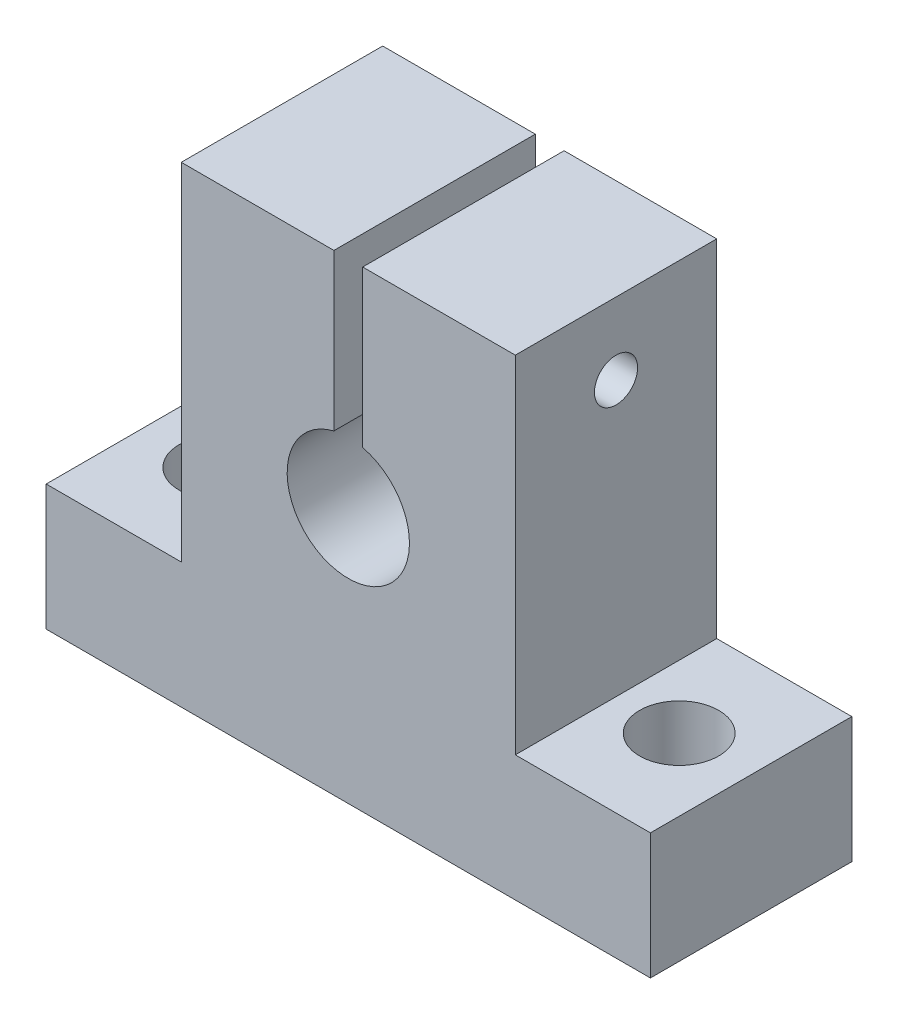
ISO-10303-21;
HEADER;
FILE_DESCRIPTION(('STEP AP214'),'2;1');
FILE_NAME('part.step','',(''),(''),'','','');
FILE_SCHEMA(('AUTOMOTIVE_DESIGN { 1 0 10303 214 1 1 1 1 }'));
ENDSEC;
DATA;
#1=APPLICATION_CONTEXT('core data for automotive mechanical design processes');
#2=APPLICATION_PROTOCOL_DEFINITION('international standard','automotive_design',2000,#1);
#3=PRODUCT_CONTEXT('',#1,'mechanical');
#4=PRODUCT('Part','Part','',(#3));
#5=PRODUCT_RELATED_PRODUCT_CATEGORY('part','',(#4));
#6=PRODUCT_DEFINITION_FORMATION('','',#4);
#7=PRODUCT_DEFINITION_CONTEXT('part definition',#1,'design');
#8=PRODUCT_DEFINITION('design','',#6,#7);
#9=PRODUCT_DEFINITION_SHAPE('','',#8);
#10=(LENGTH_UNIT() NAMED_UNIT(*) SI_UNIT(.MILLI.,.METRE.));
#11=(NAMED_UNIT(*) PLANE_ANGLE_UNIT() SI_UNIT($,.RADIAN.));
#12=(NAMED_UNIT(*) SI_UNIT($,.STERADIAN.) SOLID_ANGLE_UNIT());
#13=UNCERTAINTY_MEASURE_WITH_UNIT(LENGTH_MEASURE(1.E-05),#10,'distance_accuracy_value','');
#14=(GEOMETRIC_REPRESENTATION_CONTEXT(3) GLOBAL_UNCERTAINTY_ASSIGNED_CONTEXT((#13)) GLOBAL_UNIT_ASSIGNED_CONTEXT((#10,
#11,#12)) REPRESENTATION_CONTEXT('',''));
#15=CARTESIAN_POINT('',(0.,0.,0.));
#16=DIRECTION('',(0.,0.,1.));
#17=DIRECTION('',(1.,0.,0.));
#18=AXIS2_PLACEMENT_3D('',#15,#16,#17);
#19=CARTESIAN_POINT('',(0.,8.73752791003439,14.));
#20=DIRECTION('',(1.,0.,0.));
#21=DIRECTION('',(0.,0.,-1.));
#22=AXIS2_PLACEMENT_3D('',#19,#20,#21);
#23=PLANE('',#22);
#24=DIRECTION('',(0.,-1.,0.));
#25=VECTOR('',#24,1.);
#26=CARTESIAN_POINT('',(0.,8.73752791003439,0.));
#27=LINE('',#26,#25);
#28=CARTESIAN_POINT('',(0.,8.73752791003439,0.));
#29=VERTEX_POINT('',#28);
#30=CARTESIAN_POINT('',(0.,0.,0.));
#31=VERTEX_POINT('',#30);
#32=EDGE_CURVE('E152',#29,#31,#27,.T.);
#33=ORIENTED_EDGE('',*,*,#32,.T.);
#34=DIRECTION('',(0.,0.,-1.));
#35=VECTOR('',#34,1.);
#36=CARTESIAN_POINT('',(0.,0.,14.));
#37=LINE('',#36,#35);
#38=CARTESIAN_POINT('',(0.,0.,14.));
#39=VERTEX_POINT('',#38);
#40=EDGE_CURVE('E39',#39,#31,#37,.T.);
#41=ORIENTED_EDGE('',*,*,#40,.F.);
#42=DIRECTION('',(0.,-1.,0.));
#43=VECTOR('',#42,1.);
#44=CARTESIAN_POINT('',(0.,8.73752791003439,14.));
#45=LINE('',#44,#43);
#46=CARTESIAN_POINT('',(0.,8.73752791003439,14.));
#47=VERTEX_POINT('',#46);
#48=EDGE_CURVE('E174',#47,#39,#45,.T.);
#49=ORIENTED_EDGE('',*,*,#48,.F.);
#50=DIRECTION('',(0.,0.,-1.));
#51=VECTOR('',#50,1.);
#52=CARTESIAN_POINT('',(0.,8.73752791003439,14.));
#53=LINE('',#52,#51);
#54=EDGE_CURVE('E148',#47,#29,#53,.T.);
#55=ORIENTED_EDGE('',*,*,#54,.T.);
#56=EDGE_LOOP('',(#33,#41,#49,#55));
#57=FACE_BOUND('',#56,.T.);
#58=ADVANCED_FACE('F31',(#57),#23,.F.);
#59=CARTESIAN_POINT('',(0.,0.,14.));
#60=DIRECTION('',(0.,1.,0.));
#61=DIRECTION('',(0.,0.,1.));
#62=AXIS2_PLACEMENT_3D('',#59,#60,#61);
#63=PLANE('',#62);
#64=CARTESIAN_POINT('',(37.,0.,7.));
#65=DIRECTION('',(0.,1.,0.));
#66=DIRECTION('',(-1.,0.,0.));
#67=AXIS2_PLACEMENT_3D('',#64,#65,#66);
#68=CIRCLE('',#67,2.75);
#69=CARTESIAN_POINT('',(34.25,0.,7.));
#70=VERTEX_POINT('',#69);
#71=EDGE_CURVE('E245',#70,#70,#68,.T.);
#72=ORIENTED_EDGE('',*,*,#71,.T.);
#73=EDGE_LOOP('',(#72));
#74=FACE_BOUND('',#73,.T.);
#75=CARTESIAN_POINT('',(5.,0.,7.));
#76=DIRECTION('',(0.,1.,0.));
#77=DIRECTION('',(-1.,0.,0.));
#78=AXIS2_PLACEMENT_3D('',#75,#76,#77);
#79=CIRCLE('',#78,2.75);
#80=CARTESIAN_POINT('',(2.25,0.,7.));
#81=VERTEX_POINT('',#80);
#82=EDGE_CURVE('E241',#81,#81,#79,.T.);
#83=ORIENTED_EDGE('',*,*,#82,.T.);
#84=EDGE_LOOP('',(#83));
#85=FACE_BOUND('',#84,.T.);
#86=DIRECTION('',(1.,0.,0.));
#87=VECTOR('',#86,1.);
#88=CARTESIAN_POINT('',(0.,0.,0.));
#89=LINE('',#88,#87);
#90=CARTESIAN_POINT('',(42.,0.,0.));
#91=VERTEX_POINT('',#90);
#92=EDGE_CURVE('E155',#31,#91,#89,.T.);
#93=ORIENTED_EDGE('',*,*,#92,.T.);
#94=DIRECTION('',(0.,0.,-1.));
#95=VECTOR('',#94,1.);
#96=CARTESIAN_POINT('',(42.,0.,14.));
#97=LINE('',#96,#95);
#98=CARTESIAN_POINT('',(42.,0.,14.));
#99=VERTEX_POINT('',#98);
#100=EDGE_CURVE('E190',#99,#91,#97,.T.);
#101=ORIENTED_EDGE('',*,*,#100,.F.);
#102=DIRECTION('',(1.,0.,0.));
#103=VECTOR('',#102,1.);
#104=CARTESIAN_POINT('',(0.,0.,14.));
#105=LINE('',#104,#103);
#106=EDGE_CURVE('E102',#39,#99,#105,.T.);
#107=ORIENTED_EDGE('',*,*,#106,.F.);
#108=ORIENTED_EDGE('',*,*,#40,.T.);
#109=EDGE_LOOP('',(#93,#101,#107,#108));
#110=FACE_BOUND('',#109,.T.);
#111=ADVANCED_FACE('F194',(#74,#85,#110),#63,.F.);
#112=CARTESIAN_POINT('',(42.,0.,14.));
#113=DIRECTION('',(-1.,0.,0.));
#114=DIRECTION('',(0.,0.,1.));
#115=AXIS2_PLACEMENT_3D('',#112,#113,#114);
#116=PLANE('',#115);
#117=DIRECTION('',(0.,1.,0.));
#118=VECTOR('',#117,1.);
#119=CARTESIAN_POINT('',(42.,0.,0.));
#120=LINE('',#119,#118);
#121=CARTESIAN_POINT('',(42.,8.73752791003439,0.));
#122=VERTEX_POINT('',#121);
#123=EDGE_CURVE('E157',#91,#122,#120,.T.);
#124=ORIENTED_EDGE('',*,*,#123,.T.);
#125=DIRECTION('',(0.,0.,-1.));
#126=VECTOR('',#125,1.);
#127=CARTESIAN_POINT('',(42.,8.73752791003439,14.));
#128=LINE('',#127,#126);
#129=CARTESIAN_POINT('',(42.,8.73752791003439,14.));
#130=VERTEX_POINT('',#129);
#131=EDGE_CURVE('E187',#130,#122,#128,.T.);
#132=ORIENTED_EDGE('',*,*,#131,.F.);
#133=DIRECTION('',(0.,1.,0.));
#134=VECTOR('',#133,1.);
#135=CARTESIAN_POINT('',(42.,0.,14.));
#136=LINE('',#135,#134);
#137=EDGE_CURVE('E215',#99,#130,#136,.T.);
#138=ORIENTED_EDGE('',*,*,#137,.F.);
#139=ORIENTED_EDGE('',*,*,#100,.T.);
#140=EDGE_LOOP('',(#124,#132,#138,#139));
#141=FACE_BOUND('',#140,.T.);
#142=ADVANCED_FACE('F206',(#141),#116,.F.);
#143=CARTESIAN_POINT('',(42.,8.73752791003439,14.));
#144=DIRECTION('',(0.,-1.,0.));
#145=DIRECTION('',(1.,0.,0.));
#146=AXIS2_PLACEMENT_3D('',#143,#144,#145);
#147=PLANE('',#146);
#148=CARTESIAN_POINT('',(37.,8.7375279100344,7.));
#149=DIRECTION('',(0.,1.,0.));
#150=DIRECTION('',(-1.,0.,0.));
#151=AXIS2_PLACEMENT_3D('',#148,#149,#150);
#152=CIRCLE('',#151,2.75);
#153=CARTESIAN_POINT('',(34.25,8.7375279100344,7.));
#154=VERTEX_POINT('',#153);
#155=EDGE_CURVE('E248',#154,#154,#152,.T.);
#156=ORIENTED_EDGE('',*,*,#155,.F.);
#157=EDGE_LOOP('',(#156));
#158=FACE_BOUND('',#157,.T.);
#159=DIRECTION('',(-1.,0.,0.));
#160=VECTOR('',#159,1.);
#161=CARTESIAN_POINT('',(42.,8.73752791003439,0.));
#162=LINE('',#161,#160);
#163=CARTESIAN_POINT('',(32.609283578352,8.73752791003439,0.));
#164=VERTEX_POINT('',#163);
#165=EDGE_CURVE('E159',#122,#164,#162,.T.);
#166=ORIENTED_EDGE('',*,*,#165,.T.);
#167=DIRECTION('',(0.,0.,-1.));
#168=VECTOR('',#167,1.);
#169=CARTESIAN_POINT('',(32.609283578352,8.73752791003439,14.));
#170=LINE('',#169,#168);
#171=CARTESIAN_POINT('',(32.609283578352,8.73752791003439,14.));
#172=VERTEX_POINT('',#171);
#173=EDGE_CURVE('E184',#172,#164,#170,.T.);
#174=ORIENTED_EDGE('',*,*,#173,.F.);
#175=DIRECTION('',(-1.,0.,0.));
#176=VECTOR('',#175,1.);
#177=CARTESIAN_POINT('',(42.,8.73752791003439,14.));
#178=LINE('',#177,#176);
#179=EDGE_CURVE('E212',#130,#172,#178,.T.);
#180=ORIENTED_EDGE('',*,*,#179,.F.);
#181=ORIENTED_EDGE('',*,*,#131,.T.);
#182=EDGE_LOOP('',(#166,#174,#180,#181));
#183=FACE_BOUND('',#182,.T.);
#184=ADVANCED_FACE('F210',(#158,#183),#147,.F.);
#185=CARTESIAN_POINT('',(32.609283578352,8.73752791003439,14.));
#186=DIRECTION('',(-1.,0.,0.));
#187=DIRECTION('',(0.,0.,1.));
#188=AXIS2_PLACEMENT_3D('',#185,#186,#187);
#189=PLANE('',#188);
#190=CARTESIAN_POINT('',(32.609283578352,27.8,7.));
#191=DIRECTION('',(1.,0.,0.));
#192=DIRECTION('',(0.,0.,-1.));
#193=AXIS2_PLACEMENT_3D('',#190,#191,#192);
#194=CIRCLE('',#193,1.5);
#195=CARTESIAN_POINT('',(32.609283578352,27.8,5.5));
#196=VERTEX_POINT('',#195);
#197=EDGE_CURVE('E259',#196,#196,#194,.T.);
#198=ORIENTED_EDGE('',*,*,#197,.F.);
#199=EDGE_LOOP('',(#198));
#200=FACE_BOUND('',#199,.T.);
#201=DIRECTION('',(0.,1.,0.));
#202=VECTOR('',#201,1.);
#203=CARTESIAN_POINT('',(32.609283578352,8.73752791003439,0.));
#204=LINE('',#203,#202);
#205=CARTESIAN_POINT('',(32.609283578352,32.8,0.));
#206=VERTEX_POINT('',#205);
#207=EDGE_CURVE('E161',#164,#206,#204,.T.);
#208=ORIENTED_EDGE('',*,*,#207,.T.);
#209=DIRECTION('',(0.,0.,-1.));
#210=VECTOR('',#209,1.);
#211=CARTESIAN_POINT('',(32.609283578352,32.8,14.));
#212=LINE('',#211,#210);
#213=CARTESIAN_POINT('',(32.609283578352,32.8,14.));
#214=VERTEX_POINT('',#213);
#215=EDGE_CURVE('E181',#214,#206,#212,.T.);
#216=ORIENTED_EDGE('',*,*,#215,.F.);
#217=DIRECTION('',(0.,1.,0.));
#218=VECTOR('',#217,1.);
#219=CARTESIAN_POINT('',(32.609283578352,8.73752791003439,14.));
#220=LINE('',#219,#218);
#221=EDGE_CURVE('E214',#172,#214,#220,.T.);
#222=ORIENTED_EDGE('',*,*,#221,.F.);
#223=ORIENTED_EDGE('',*,*,#173,.T.);
#224=EDGE_LOOP('',(#208,#216,#222,#223));
#225=FACE_BOUND('',#224,.T.);
#226=ADVANCED_FACE('F308',(#200,#225),#189,.F.);
#227=CARTESIAN_POINT('',(22.,32.8,14.));
#228=DIRECTION('',(0.,-1.,0.));
#229=DIRECTION('',(0.,0.,-1.));
#230=AXIS2_PLACEMENT_3D('',#227,#228,#229);
#231=PLANE('',#230);
#232=DIRECTION('',(-1.,0.,0.));
#233=VECTOR('',#232,1.);
#234=CARTESIAN_POINT('',(22.,32.8,0.));
#235=LINE('',#234,#233);
#236=CARTESIAN_POINT('',(22.,32.8,0.));
#237=VERTEX_POINT('',#236);
#238=EDGE_CURVE('E163',#206,#237,#235,.T.);
#239=ORIENTED_EDGE('',*,*,#238,.T.);
#240=DIRECTION('',(0.,0.,-1.));
#241=VECTOR('',#240,1.);
#242=CARTESIAN_POINT('',(22.,32.8,14.));
#243=LINE('',#242,#241);
#244=CARTESIAN_POINT('',(22.,32.8,14.));
#245=VERTEX_POINT('',#244);
#246=EDGE_CURVE('E178',#245,#237,#243,.T.);
#247=ORIENTED_EDGE('',*,*,#246,.F.);
#248=DIRECTION('',(-1.,0.,0.));
#249=VECTOR('',#248,1.);
#250=CARTESIAN_POINT('',(22.,32.8,14.));
#251=LINE('',#250,#249);
#252=EDGE_CURVE('E217',#214,#245,#251,.T.);
#253=ORIENTED_EDGE('',*,*,#252,.F.);
#254=ORIENTED_EDGE('',*,*,#215,.T.);
#255=EDGE_LOOP('',(#239,#247,#253,#254));
#256=FACE_BOUND('',#255,.T.);
#257=ADVANCED_FACE('F312',(#256),#231,.F.);
#258=CARTESIAN_POINT('',(22.,17.8,14.));
#259=DIRECTION('',(1.,0.,0.));
#260=DIRECTION('',(0.,0.,-1.));
#261=AXIS2_PLACEMENT_3D('',#258,#259,#260);
#262=PLANE('',#261);
#263=CARTESIAN_POINT('',(22.,27.8,7.));
#264=DIRECTION('',(1.,0.,0.));
#265=DIRECTION('',(0.,0.,-1.));
#266=AXIS2_PLACEMENT_3D('',#263,#264,#265);
#267=CIRCLE('',#266,1.5);
#268=CARTESIAN_POINT('',(22.,27.8,5.5));
#269=VERTEX_POINT('',#268);
#270=EDGE_CURVE('E251',#269,#269,#267,.T.);
#271=ORIENTED_EDGE('',*,*,#270,.T.);
#272=EDGE_LOOP('',(#271));
#273=FACE_BOUND('',#272,.T.);
#274=DIRECTION('',(0.,-1.,0.));
#275=VECTOR('',#274,1.);
#276=CARTESIAN_POINT('',(22.,17.8,0.));
#277=LINE('',#276,#275);
#278=CARTESIAN_POINT('',(22.,21.9306779104646,0.));
#279=VERTEX_POINT('',#278);
#280=EDGE_CURVE('E165',#237,#279,#277,.T.);
#281=ORIENTED_EDGE('',*,*,#280,.T.);
#282=DIRECTION('',(0.,0.,1.));
#283=VECTOR('',#282,1.);
#284=CARTESIAN_POINT('',(22.,21.9306779104646,0.));
#285=LINE('',#284,#283);
#286=CARTESIAN_POINT('',(22.,21.9306779104646,14.));
#287=VERTEX_POINT('',#286);
#288=EDGE_CURVE('E46',#279,#287,#285,.T.);
#289=ORIENTED_EDGE('',*,*,#288,.T.);
#290=DIRECTION('',(0.,-1.,0.));
#291=VECTOR('',#290,1.);
#292=CARTESIAN_POINT('',(22.,17.8,14.));
#293=LINE('',#292,#291);
#294=EDGE_CURVE('E223',#245,#287,#293,.T.);
#295=ORIENTED_EDGE('',*,*,#294,.F.);
#296=ORIENTED_EDGE('',*,*,#246,.T.);
#297=EDGE_LOOP('',(#281,#289,#295,#296));
#298=FACE_BOUND('',#297,.T.);
#299=ADVANCED_FACE('F232',(#273,#298),#262,.F.);
#300=CARTESIAN_POINT('',(20.,32.8,14.));
#301=DIRECTION('',(-1.,0.,0.));
#302=DIRECTION('',(0.,0.,1.));
#303=AXIS2_PLACEMENT_3D('',#300,#301,#302);
#304=PLANE('',#303);
#305=CARTESIAN_POINT('',(20.,27.8,7.));
#306=DIRECTION('',(-1.,0.,0.));
#307=DIRECTION('',(0.,0.,1.));
#308=AXIS2_PLACEMENT_3D('',#305,#306,#307);
#309=CIRCLE('',#308,1.5);
#310=CARTESIAN_POINT('',(20.,27.8,8.5));
#311=VERTEX_POINT('',#310);
#312=EDGE_CURVE('E256',#311,#311,#309,.T.);
#313=ORIENTED_EDGE('',*,*,#312,.T.);
#314=EDGE_LOOP('',(#313));
#315=FACE_BOUND('',#314,.T.);
#316=DIRECTION('',(0.,1.,0.));
#317=VECTOR('',#316,1.);
#318=CARTESIAN_POINT('',(20.,32.8,14.));
#319=LINE('',#318,#317);
#320=CARTESIAN_POINT('',(20.,21.9306779104646,14.));
#321=VERTEX_POINT('',#320);
#322=CARTESIAN_POINT('',(20.,32.8,14.));
#323=VERTEX_POINT('',#322);
#324=EDGE_CURVE('E131',#321,#323,#319,.T.);
#325=ORIENTED_EDGE('',*,*,#324,.F.);
#326=DIRECTION('',(0.,0.,1.));
#327=VECTOR('',#326,1.);
#328=CARTESIAN_POINT('',(20.,21.9306779104646,0.));
#329=LINE('',#328,#327);
#330=CARTESIAN_POINT('',(20.,21.9306779104646,0.));
#331=VERTEX_POINT('',#330);
#332=EDGE_CURVE('E234',#321,#331,#329,.F.);
#333=ORIENTED_EDGE('',*,*,#332,.T.);
#334=DIRECTION('',(0.,1.,0.));
#335=VECTOR('',#334,1.);
#336=CARTESIAN_POINT('',(20.,32.8,0.));
#337=LINE('',#336,#335);
#338=CARTESIAN_POINT('',(20.,32.8,0.));
#339=VERTEX_POINT('',#338);
#340=EDGE_CURVE('E168',#331,#339,#337,.T.);
#341=ORIENTED_EDGE('',*,*,#340,.T.);
#342=DIRECTION('',(0.,0.,-1.));
#343=VECTOR('',#342,1.);
#344=CARTESIAN_POINT('',(20.,32.8,14.));
#345=LINE('',#344,#343);
#346=EDGE_CURVE('E143',#323,#339,#345,.T.);
#347=ORIENTED_EDGE('',*,*,#346,.F.);
#348=EDGE_LOOP('',(#325,#333,#341,#347));
#349=FACE_BOUND('',#348,.T.);
#350=ADVANCED_FACE('F275',(#315,#349),#304,.F.);
#351=CARTESIAN_POINT('',(9.39071642164796,32.8,14.));
#352=DIRECTION('',(0.,-1.,0.));
#353=DIRECTION('',(0.,0.,-1.));
#354=AXIS2_PLACEMENT_3D('',#351,#352,#353);
#355=PLANE('',#354);
#356=DIRECTION('',(-1.,0.,0.));
#357=VECTOR('',#356,1.);
#358=CARTESIAN_POINT('',(9.39071642164796,32.8,0.));
#359=LINE('',#358,#357);
#360=CARTESIAN_POINT('',(9.39071642164796,32.8,0.));
#361=VERTEX_POINT('',#360);
#362=EDGE_CURVE('E140',#339,#361,#359,.T.);
#363=ORIENTED_EDGE('',*,*,#362,.T.);
#364=DIRECTION('',(0.,0.,-1.));
#365=VECTOR('',#364,1.);
#366=CARTESIAN_POINT('',(9.39071642164796,32.8,14.));
#367=LINE('',#366,#365);
#368=CARTESIAN_POINT('',(9.39071642164796,32.8,14.));
#369=VERTEX_POINT('',#368);
#370=EDGE_CURVE('E137',#369,#361,#367,.T.);
#371=ORIENTED_EDGE('',*,*,#370,.F.);
#372=DIRECTION('',(-1.,0.,0.));
#373=VECTOR('',#372,1.);
#374=CARTESIAN_POINT('',(9.39071642164796,32.8,14.));
#375=LINE('',#374,#373);
#376=EDGE_CURVE('E123',#323,#369,#375,.T.);
#377=ORIENTED_EDGE('',*,*,#376,.F.);
#378=ORIENTED_EDGE('',*,*,#346,.T.);
#379=EDGE_LOOP('',(#363,#371,#377,#378));
#380=FACE_BOUND('',#379,.T.);
#381=ADVANCED_FACE('F138',(#380),#355,.F.);
#382=CARTESIAN_POINT('',(9.39071642164796,32.8,14.));
#383=DIRECTION('',(1.,0.,0.));
#384=DIRECTION('',(0.,0.,-1.));
#385=AXIS2_PLACEMENT_3D('',#382,#383,#384);
#386=PLANE('',#385);
#387=CARTESIAN_POINT('',(9.39071642164796,27.8,7.));
#388=DIRECTION('',(1.,0.,0.));
#389=DIRECTION('',(0.,0.,-1.));
#390=AXIS2_PLACEMENT_3D('',#387,#388,#389);
#391=CIRCLE('',#390,1.5);
#392=CARTESIAN_POINT('',(9.39071642164796,27.8,5.5));
#393=VERTEX_POINT('',#392);
#394=EDGE_CURVE('E34',#393,#393,#391,.T.);
#395=ORIENTED_EDGE('',*,*,#394,.T.);
#396=EDGE_LOOP('',(#395));
#397=FACE_BOUND('',#396,.T.);
#398=DIRECTION('',(0.,-1.,0.));
#399=VECTOR('',#398,1.);
#400=CARTESIAN_POINT('',(9.39071642164796,32.8,0.));
#401=LINE('',#400,#399);
#402=CARTESIAN_POINT('',(9.39071642164796,8.73752791003439,0.));
#403=VERTEX_POINT('',#402);
#404=EDGE_CURVE('E171',#361,#403,#401,.T.);
#405=ORIENTED_EDGE('',*,*,#404,.T.);
#406=DIRECTION('',(0.,0.,-1.));
#407=VECTOR('',#406,1.);
#408=CARTESIAN_POINT('',(9.39071642164796,8.73752791003439,14.));
#409=LINE('',#408,#407);
#410=CARTESIAN_POINT('',(9.39071642164796,8.73752791003439,14.));
#411=VERTEX_POINT('',#410);
#412=EDGE_CURVE('E144',#411,#403,#409,.T.);
#413=ORIENTED_EDGE('',*,*,#412,.F.);
#414=DIRECTION('',(0.,-1.,0.));
#415=VECTOR('',#414,1.);
#416=CARTESIAN_POINT('',(9.39071642164796,32.8,14.));
#417=LINE('',#416,#415);
#418=EDGE_CURVE('E128',#369,#411,#417,.T.);
#419=ORIENTED_EDGE('',*,*,#418,.F.);
#420=ORIENTED_EDGE('',*,*,#370,.T.);
#421=EDGE_LOOP('',(#405,#413,#419,#420));
#422=FACE_BOUND('',#421,.T.);
#423=ADVANCED_FACE('F146',(#397,#422),#386,.F.);
#424=CARTESIAN_POINT('',(9.39071642164796,8.73752791003439,14.));
#425=DIRECTION('',(0.,-1.,0.));
#426=DIRECTION('',(1.,0.,0.));
#427=AXIS2_PLACEMENT_3D('',#424,#425,#426);
#428=PLANE('',#427);
#429=CARTESIAN_POINT('',(5.,8.73752791003439,7.));
#430=DIRECTION('',(0.,1.,0.));
#431=DIRECTION('',(-1.,0.,0.));
#432=AXIS2_PLACEMENT_3D('',#429,#430,#431);
#433=CIRCLE('',#432,2.75);
#434=CARTESIAN_POINT('',(2.25,8.73752791003439,7.));
#435=VERTEX_POINT('',#434);
#436=EDGE_CURVE('E242',#435,#435,#433,.T.);
#437=ORIENTED_EDGE('',*,*,#436,.F.);
#438=EDGE_LOOP('',(#437));
#439=FACE_BOUND('',#438,.T.);
#440=DIRECTION('',(-1.,0.,0.));
#441=VECTOR('',#440,1.);
#442=CARTESIAN_POINT('',(9.39071642164796,8.73752791003439,0.));
#443=LINE('',#442,#441);
#444=EDGE_CURVE('E93',#403,#29,#443,.T.);
#445=ORIENTED_EDGE('',*,*,#444,.T.);
#446=ORIENTED_EDGE('',*,*,#54,.F.);
#447=DIRECTION('',(-1.,0.,0.));
#448=VECTOR('',#447,1.);
#449=CARTESIAN_POINT('',(9.39071642164796,8.73752791003439,14.));
#450=LINE('',#449,#448);
#451=EDGE_CURVE('E54',#411,#47,#450,.T.);
#452=ORIENTED_EDGE('',*,*,#451,.F.);
#453=ORIENTED_EDGE('',*,*,#412,.T.);
#454=EDGE_LOOP('',(#445,#446,#452,#453));
#455=FACE_BOUND('',#454,.T.);
#456=ADVANCED_FACE('F283',(#439,#455),#428,.F.);
#457=CARTESIAN_POINT('',(0.,0.,14.));
#458=DIRECTION('',(0.,0.,1.));
#459=DIRECTION('',(1.,0.,0.));
#460=AXIS2_PLACEMENT_3D('',#457,#458,#459);
#461=PLANE('',#460);
#462=CARTESIAN_POINT('',(21.,17.8,14.));
#463=DIRECTION('',(0.,0.,1.));
#464=DIRECTION('',(1.,0.,0.));
#465=AXIS2_PLACEMENT_3D('',#462,#463,#464);
#466=CIRCLE('',#465,4.25);
#467=EDGE_CURVE('E227',#321,#287,#466,.T.);
#468=ORIENTED_EDGE('',*,*,#467,.F.);
#469=ORIENTED_EDGE('',*,*,#324,.T.);
#470=ORIENTED_EDGE('',*,*,#376,.T.);
#471=ORIENTED_EDGE('',*,*,#418,.T.);
#472=ORIENTED_EDGE('',*,*,#451,.T.);
#473=ORIENTED_EDGE('',*,*,#48,.T.);
#474=ORIENTED_EDGE('',*,*,#106,.T.);
#475=ORIENTED_EDGE('',*,*,#137,.T.);
#476=ORIENTED_EDGE('',*,*,#179,.T.);
#477=ORIENTED_EDGE('',*,*,#221,.T.);
#478=ORIENTED_EDGE('',*,*,#252,.T.);
#479=ORIENTED_EDGE('',*,*,#294,.T.);
#480=EDGE_LOOP('',(#468,#469,#470,#471,#472,#473,#474,#475,#476,#477,#478,#479));
#481=FACE_BOUND('',#480,.T.);
#482=ADVANCED_FACE('F126',(#481),#461,.T.);
#483=CARTESIAN_POINT('',(0.,0.,0.));
#484=DIRECTION('',(0.,0.,1.));
#485=DIRECTION('',(1.,0.,0.));
#486=AXIS2_PLACEMENT_3D('',#483,#484,#485);
#487=PLANE('',#486);
#488=ORIENTED_EDGE('',*,*,#340,.F.);
#489=CARTESIAN_POINT('',(21.,17.8,0.));
#490=DIRECTION('',(0.,0.,1.));
#491=DIRECTION('',(1.,0.,0.));
#492=AXIS2_PLACEMENT_3D('',#489,#490,#491);
#493=CIRCLE('',#492,4.25);
#494=EDGE_CURVE('E11',#331,#279,#493,.T.);
#495=ORIENTED_EDGE('',*,*,#494,.T.);
#496=ORIENTED_EDGE('',*,*,#280,.F.);
#497=ORIENTED_EDGE('',*,*,#238,.F.);
#498=ORIENTED_EDGE('',*,*,#207,.F.);
#499=ORIENTED_EDGE('',*,*,#165,.F.);
#500=ORIENTED_EDGE('',*,*,#123,.F.);
#501=ORIENTED_EDGE('',*,*,#92,.F.);
#502=ORIENTED_EDGE('',*,*,#32,.F.);
#503=ORIENTED_EDGE('',*,*,#444,.F.);
#504=ORIENTED_EDGE('',*,*,#404,.F.);
#505=ORIENTED_EDGE('',*,*,#362,.F.);
#506=EDGE_LOOP('',(#488,#495,#496,#497,#498,#499,#500,#501,#502,#503,#504,#505));
#507=FACE_BOUND('',#506,.T.);
#508=ADVANCED_FACE('F200',(#507),#487,.F.);
#509=CARTESIAN_POINT('',(21.,17.8,0.));
#510=DIRECTION('',(0.,0.,1.));
#511=DIRECTION('',(1.,0.,0.));
#512=AXIS2_PLACEMENT_3D('',#509,#510,#511);
#513=CYLINDRICAL_SURFACE('',#512,4.25);
#514=ORIENTED_EDGE('',*,*,#494,.F.);
#515=ORIENTED_EDGE('',*,*,#332,.F.);
#516=ORIENTED_EDGE('',*,*,#467,.T.);
#517=ORIENTED_EDGE('',*,*,#288,.F.);
#518=EDGE_LOOP('',(#514,#515,#516,#517));
#519=FACE_BOUND('',#518,.T.);
#520=ADVANCED_FACE('F280',(#519),#513,.F.);
#521=CARTESIAN_POINT('',(5.,0.,7.));
#522=DIRECTION('',(0.,1.,0.));
#523=DIRECTION('',(-1.,0.,0.));
#524=AXIS2_PLACEMENT_3D('',#521,#522,#523);
#525=CYLINDRICAL_SURFACE('',#524,2.75);
#526=ORIENTED_EDGE('',*,*,#82,.F.);
#527=EDGE_LOOP('',(#526));
#528=FACE_BOUND('',#527,.T.);
#529=ORIENTED_EDGE('',*,*,#436,.T.);
#530=EDGE_LOOP('',(#529));
#531=FACE_BOUND('',#530,.T.);
#532=ADVANCED_FACE('F357',(#528,#531),#525,.F.);
#533=CARTESIAN_POINT('',(37.,0.,7.));
#534=DIRECTION('',(0.,1.,0.));
#535=DIRECTION('',(-1.,0.,0.));
#536=AXIS2_PLACEMENT_3D('',#533,#534,#535);
#537=CYLINDRICAL_SURFACE('',#536,2.75);
#538=ORIENTED_EDGE('',*,*,#71,.F.);
#539=EDGE_LOOP('',(#538));
#540=FACE_BOUND('',#539,.T.);
#541=ORIENTED_EDGE('',*,*,#155,.T.);
#542=EDGE_LOOP('',(#541));
#543=FACE_BOUND('',#542,.T.);
#544=ADVANCED_FACE('F271',(#540,#543),#537,.F.);
#545=CARTESIAN_POINT('',(0.,27.8,7.));
#546=DIRECTION('',(1.,0.,0.));
#547=DIRECTION('',(0.,0.,-1.));
#548=AXIS2_PLACEMENT_3D('',#545,#546,#547);
#549=CYLINDRICAL_SURFACE('',#548,1.5);
#550=ORIENTED_EDGE('',*,*,#394,.F.);
#551=EDGE_LOOP('',(#550));
#552=FACE_BOUND('',#551,.T.);
#553=ORIENTED_EDGE('',*,*,#312,.F.);
#554=EDGE_LOOP('',(#553));
#555=FACE_BOUND('',#554,.T.);
#556=ADVANCED_FACE('F267',(#552,#555),#549,.F.);
#557=ORIENTED_EDGE('',*,*,#197,.T.);
#558=EDGE_LOOP('',(#557));
#559=FACE_BOUND('',#558,.T.);
#560=ORIENTED_EDGE('',*,*,#270,.F.);
#561=EDGE_LOOP('',(#560));
#562=FACE_BOUND('',#561,.T.);
#563=ADVANCED_FACE('F270',(#559,#562),#549,.F.);
#564=CLOSED_SHELL('',(#58,#111,#142,#184,#226,#257,#299,#350,#381,#423,#456,#482,#508,#520,#532,
#544,#556,#563));
#565=MANIFOLD_SOLID_BREP('B2',#564);
#566=ADVANCED_BREP_SHAPE_REPRESENTATION('',(#18,#565),#14);
#567=SHAPE_DEFINITION_REPRESENTATION(#9,#566);
ENDSEC;
END-ISO-10303-21;
